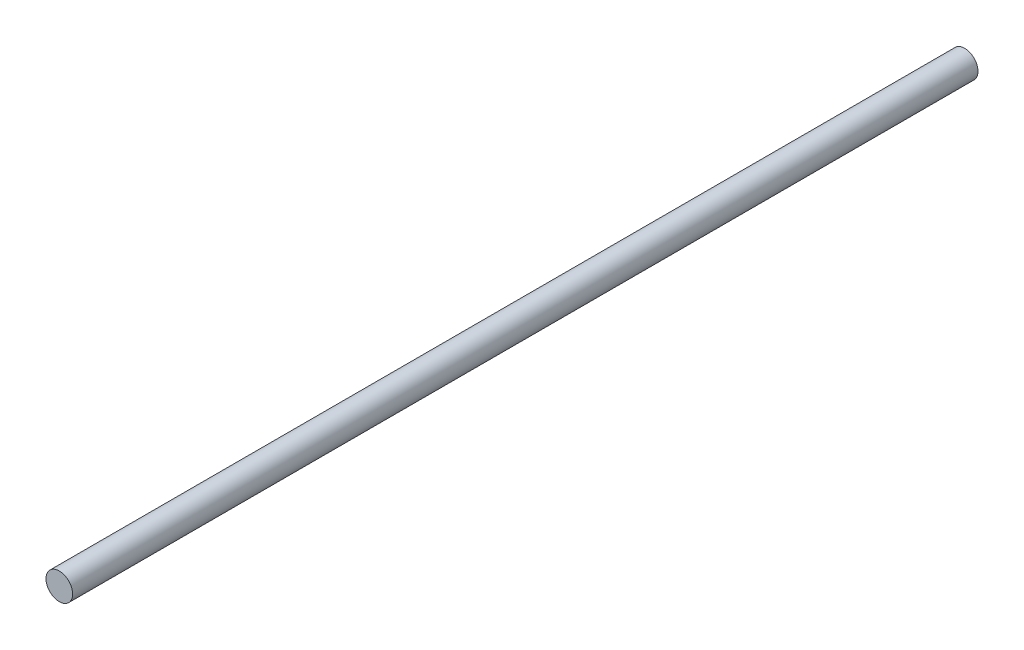
ISO-10303-21;
HEADER;
FILE_DESCRIPTION(('STEP AP214'),'2;1');
FILE_NAME('part.step','',(''),(''),'','','');
FILE_SCHEMA(('AUTOMOTIVE_DESIGN { 1 0 10303 214 1 1 1 1 }'));
ENDSEC;
DATA;
#1=APPLICATION_CONTEXT('core data for automotive mechanical design processes');
#2=APPLICATION_PROTOCOL_DEFINITION('international standard','automotive_design',2000,#1);
#3=PRODUCT_CONTEXT('',#1,'mechanical');
#4=PRODUCT('Part','Part','',(#3));
#5=PRODUCT_RELATED_PRODUCT_CATEGORY('part','',(#4));
#6=PRODUCT_DEFINITION_FORMATION('','',#4);
#7=PRODUCT_DEFINITION_CONTEXT('part definition',#1,'design');
#8=PRODUCT_DEFINITION('design','',#6,#7);
#9=PRODUCT_DEFINITION_SHAPE('','',#8);
#10=(LENGTH_UNIT() NAMED_UNIT(*) SI_UNIT(.MILLI.,.METRE.));
#11=(NAMED_UNIT(*) PLANE_ANGLE_UNIT() SI_UNIT($,.RADIAN.));
#12=(NAMED_UNIT(*) SI_UNIT($,.STERADIAN.) SOLID_ANGLE_UNIT());
#13=UNCERTAINTY_MEASURE_WITH_UNIT(LENGTH_MEASURE(1.E-05),#10,'distance_accuracy_value','');
#14=(GEOMETRIC_REPRESENTATION_CONTEXT(3) GLOBAL_UNCERTAINTY_ASSIGNED_CONTEXT((#13)) GLOBAL_UNIT_ASSIGNED_CONTEXT((#10,
#11,#12)) REPRESENTATION_CONTEXT('',''));
#15=CARTESIAN_POINT('',(0.,0.,0.));
#16=DIRECTION('',(0.,0.,1.));
#17=DIRECTION('',(1.,0.,0.));
#18=AXIS2_PLACEMENT_3D('',#15,#16,#17);
#19=CARTESIAN_POINT('',(0.,0.,215.9));
#20=DIRECTION('',(0.,0.,-1.));
#21=DIRECTION('',(-1.,0.,0.));
#22=AXIS2_PLACEMENT_3D('',#19,#20,#21);
#23=CYLINDRICAL_SURFACE('',#22,3.175);
#24=CARTESIAN_POINT('',(0.,0.,215.9));
#25=DIRECTION('',(0.,0.,1.));
#26=DIRECTION('',(1.,0.,0.));
#27=AXIS2_PLACEMENT_3D('',#24,#25,#26);
#28=CIRCLE('',#27,3.175);
#29=CARTESIAN_POINT('',(3.175,0.,215.9));
#30=VERTEX_POINT('',#29);
#31=EDGE_CURVE('E10',#30,#30,#28,.T.);
#32=ORIENTED_EDGE('',*,*,#31,.F.);
#33=EDGE_LOOP('',(#32));
#34=FACE_BOUND('',#33,.T.);
#35=CARTESIAN_POINT('',(0.,0.,0.));
#36=DIRECTION('',(0.,0.,1.));
#37=DIRECTION('',(1.,0.,0.));
#38=AXIS2_PLACEMENT_3D('',#35,#36,#37);
#39=CIRCLE('',#38,3.175);
#40=CARTESIAN_POINT('',(3.175,0.,0.));
#41=VERTEX_POINT('',#40);
#42=EDGE_CURVE('E35',#41,#41,#39,.T.);
#43=ORIENTED_EDGE('',*,*,#42,.T.);
#44=EDGE_LOOP('',(#43));
#45=FACE_BOUND('',#44,.T.);
#46=ADVANCED_FACE('F32',(#34,#45),#23,.T.);
#47=CARTESIAN_POINT('',(0.,0.,215.9));
#48=DIRECTION('',(0.,0.,1.));
#49=DIRECTION('',(1.,0.,0.));
#50=AXIS2_PLACEMENT_3D('',#47,#48,#49);
#51=PLANE('',#50);
#52=ORIENTED_EDGE('',*,*,#31,.T.);
#53=EDGE_LOOP('',(#52));
#54=FACE_BOUND('',#53,.T.);
#55=ADVANCED_FACE('F47',(#54),#51,.T.);
#56=CARTESIAN_POINT('',(0.,0.,0.));
#57=DIRECTION('',(0.,0.,1.));
#58=DIRECTION('',(1.,0.,0.));
#59=AXIS2_PLACEMENT_3D('',#56,#57,#58);
#60=PLANE('',#59);
#61=ORIENTED_EDGE('',*,*,#42,.F.);
#62=EDGE_LOOP('',(#61));
#63=FACE_BOUND('',#62,.T.);
#64=ADVANCED_FACE('F45',(#63),#60,.F.);
#65=CLOSED_SHELL('',(#46,#55,#64));
#66=MANIFOLD_SOLID_BREP('B2',#65);
#67=ADVANCED_BREP_SHAPE_REPRESENTATION('',(#18,#66),#14);
#68=SHAPE_DEFINITION_REPRESENTATION(#9,#67);
ENDSEC;
END-ISO-10303-21;
